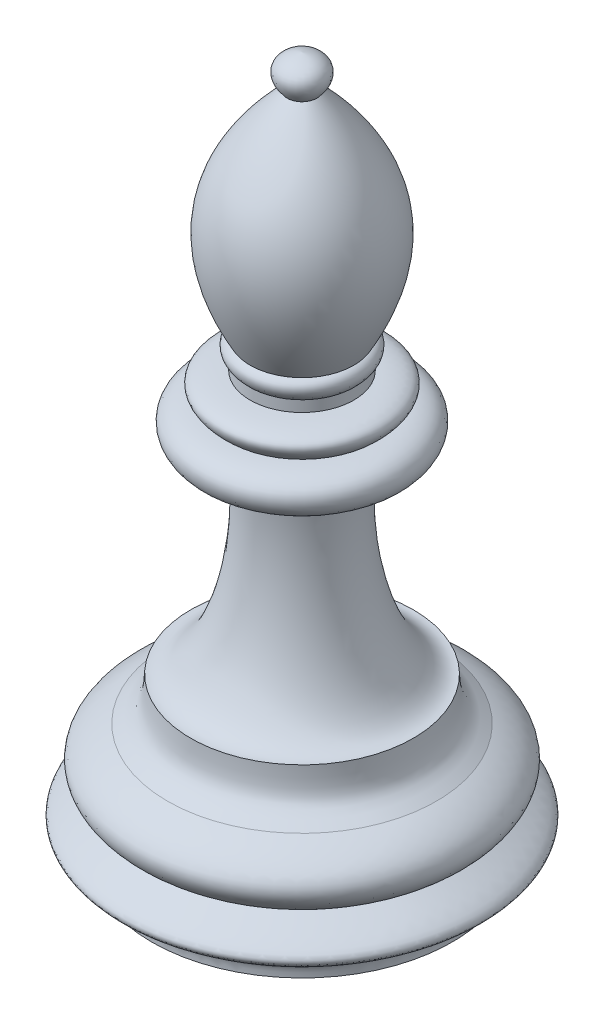
ISO-10303-21;
HEADER;
FILE_DESCRIPTION(('STEP AP214'),'2;1');
FILE_NAME('part.step','',(''),(''),'','','');
FILE_SCHEMA(('AUTOMOTIVE_DESIGN { 1 0 10303 214 1 1 1 1 }'));
ENDSEC;
DATA;
#1=APPLICATION_CONTEXT('core data for automotive mechanical design processes');
#2=APPLICATION_PROTOCOL_DEFINITION('international standard','automotive_design',2000,#1);
#3=PRODUCT_CONTEXT('',#1,'mechanical');
#4=PRODUCT('Part','Part','',(#3));
#5=PRODUCT_RELATED_PRODUCT_CATEGORY('part','',(#4));
#6=PRODUCT_DEFINITION_FORMATION('','',#4);
#7=PRODUCT_DEFINITION_CONTEXT('part definition',#1,'design');
#8=PRODUCT_DEFINITION('design','',#6,#7);
#9=PRODUCT_DEFINITION_SHAPE('','',#8);
#10=(LENGTH_UNIT() NAMED_UNIT(*) SI_UNIT(.MILLI.,.METRE.));
#11=(NAMED_UNIT(*) PLANE_ANGLE_UNIT() SI_UNIT($,.RADIAN.));
#12=(NAMED_UNIT(*) SI_UNIT($,.STERADIAN.) SOLID_ANGLE_UNIT());
#13=UNCERTAINTY_MEASURE_WITH_UNIT(LENGTH_MEASURE(1.E-05),#10,'distance_accuracy_value','');
#14=(GEOMETRIC_REPRESENTATION_CONTEXT(3) GLOBAL_UNCERTAINTY_ASSIGNED_CONTEXT((#13)) GLOBAL_UNIT_ASSIGNED_CONTEXT((#10,
#11,#12)) REPRESENTATION_CONTEXT('',''));
#15=CARTESIAN_POINT('',(0.,0.,0.));
#16=DIRECTION('',(0.,0.,1.));
#17=DIRECTION('',(1.,0.,0.));
#18=AXIS2_PLACEMENT_3D('',#15,#16,#17);
#19=CARTESIAN_POINT('',(6.90189195887826,310.970799108352,0.));
#20=CARTESIAN_POINT('',(13.6012865352146,318.346900207551,0.));
#21=CARTESIAN_POINT('',(10.3189365576846,324.620668456922,0.));
#22=CARTESIAN_POINT('',(0.,326.208286154644,0.));
#23=B_SPLINE_CURVE_WITH_KNOTS('',3,(#19,#20,#21,#22),.UNSPECIFIED.,.F.,.F.,(4,4),(0.,1.),.UNSPECIFIED.);
#24=CARTESIAN_POINT('',(0.,-19.6528747228477,0.));
#25=DIRECTION('',(0.,-1.,0.));
#26=AXIS1_PLACEMENT('',#24,#25);
#27=SURFACE_OF_REVOLUTION('',#23,#26);
#28=CARTESIAN_POINT('',(0.,326.208286154644,0.));
#29=VERTEX_POINT('',#28);
#30=VERTEX_LOOP('',#29);
#31=FACE_BOUND('',#30,.T.);
#32=CARTESIAN_POINT('',(0.,310.970799108353,0.));
#33=DIRECTION('',(0.,-1.,0.));
#34=DIRECTION('',(0.,0.,-1.));
#35=AXIS2_PLACEMENT_3D('',#32,#33,#34);
#36=CIRCLE('',#35,6.90189195887818);
#37=CARTESIAN_POINT('',(0.,310.970799108353,-6.90189195887818));
#38=VERTEX_POINT('',#37);
#39=EDGE_CURVE('E11',#38,#38,#36,.T.);
#40=ORIENTED_EDGE('',*,*,#39,.F.);
#41=EDGE_LOOP('',(#40));
#42=FACE_BOUND('',#41,.T.);
#43=ADVANCED_FACE('F32',(#31,#42),#27,.F.);
#44=CARTESIAN_POINT('',(24.347450730155,211.226381147499,0.));
#45=CARTESIAN_POINT('',(47.436331060875,252.746536673901,0.));
#46=CARTESIAN_POINT('',(36.9222244448542,281.137348254921,0.));
#47=CARTESIAN_POINT('',(6.90189195887818,310.970799108353,0.));
#48=B_SPLINE_CURVE_WITH_KNOTS('',3,(#44,#45,#46,#47),.UNSPECIFIED.,.F.,.F.,(4,4),(0.,1.),.UNSPECIFIED.);
#49=CARTESIAN_POINT('',(0.,-19.6528747228477,0.));
#50=DIRECTION('',(0.,-1.,0.));
#51=AXIS1_PLACEMENT('',#49,#50);
#52=SURFACE_OF_REVOLUTION('',#48,#51);
#53=ORIENTED_EDGE('',*,*,#39,.T.);
#54=EDGE_LOOP('',(#53));
#55=FACE_BOUND('',#54,.T.);
#56=CARTESIAN_POINT('',(0.,211.226381147499,0.));
#57=DIRECTION('',(0.,-1.,0.));
#58=DIRECTION('',(0.,0.,-1.));
#59=AXIS2_PLACEMENT_3D('',#56,#57,#58);
#60=CIRCLE('',#59,24.347450730155);
#61=CARTESIAN_POINT('',(0.,211.226381147499,-24.347450730155));
#62=VERTEX_POINT('',#61);
#63=EDGE_CURVE('E39',#62,#62,#60,.T.);
#64=ORIENTED_EDGE('',*,*,#63,.F.);
#65=EDGE_LOOP('',(#64));
#66=FACE_BOUND('',#65,.T.);
#67=ADVANCED_FACE('F44',(#55,#66),#52,.F.);
#68=CARTESIAN_POINT('',(24.347450730155,202.237263133501,0.));
#69=CARTESIAN_POINT('',(28.0464607133768,205.419181635306,0.));
#70=CARTESIAN_POINT('',(28.259658148254,209.671616611661,0.));
#71=CARTESIAN_POINT('',(24.347450730155,211.226381147499,0.));
#72=B_SPLINE_CURVE_WITH_KNOTS('',3,(#68,#69,#70,#71),.UNSPECIFIED.,.F.,.F.,(4,4),(0.,1.),.UNSPECIFIED.);
#73=CARTESIAN_POINT('',(0.,-19.6528747228477,0.));
#74=DIRECTION('',(0.,-1.,0.));
#75=AXIS1_PLACEMENT('',#73,#74);
#76=SURFACE_OF_REVOLUTION('',#72,#75);
#77=ORIENTED_EDGE('',*,*,#63,.T.);
#78=EDGE_LOOP('',(#77));
#79=FACE_BOUND('',#78,.T.);
#80=CARTESIAN_POINT('',(0.,202.237263133501,0.));
#81=DIRECTION('',(0.,-1.,0.));
#82=DIRECTION('',(0.,0.,-1.));
#83=AXIS2_PLACEMENT_3D('',#80,#81,#82);
#84=CIRCLE('',#83,24.347450730155);
#85=CARTESIAN_POINT('',(0.,202.237263133501,-24.347450730155));
#86=VERTEX_POINT('',#85);
#87=EDGE_CURVE('E53',#86,#86,#84,.T.);
#88=ORIENTED_EDGE('',*,*,#87,.F.);
#89=EDGE_LOOP('',(#88));
#90=FACE_BOUND('',#89,.T.);
#91=ADVANCED_FACE('F49',(#79,#90),#76,.F.);
#92=CARTESIAN_POINT('',(0.,-19.6528747228477,0.));
#93=DIRECTION('',(0.,-1.,0.));
#94=DIRECTION('',(0.,0.,-1.));
#95=AXIS2_PLACEMENT_3D('',#92,#93,#94);
#96=CYLINDRICAL_SURFACE('',#95,24.347450730155);
#97=ORIENTED_EDGE('',*,*,#87,.T.);
#98=EDGE_LOOP('',(#97));
#99=FACE_BOUND('',#98,.T.);
#100=CARTESIAN_POINT('',(0.,197.064280125446,0.));
#101=DIRECTION('',(0.,-1.,0.));
#102=DIRECTION('',(0.,0.,-1.));
#103=AXIS2_PLACEMENT_3D('',#100,#101,#102);
#104=CIRCLE('',#103,24.3474507301549);
#105=CARTESIAN_POINT('',(0.,197.064280125446,-24.3474507301549));
#106=VERTEX_POINT('',#105);
#107=EDGE_CURVE('E55',#106,#106,#104,.T.);
#108=ORIENTED_EDGE('',*,*,#107,.F.);
#109=EDGE_LOOP('',(#108));
#110=FACE_BOUND('',#109,.T.);
#111=ADVANCED_FACE('F101',(#99,#110),#96,.T.);
#112=CARTESIAN_POINT('',(34.3982906018401,185.158229772367,0.));
#113=CARTESIAN_POINT('',(41.8203466835881,191.710066343389,0.));
#114=CARTESIAN_POINT('',(41.2425642562907,196.685583079893,0.));
#115=CARTESIAN_POINT('',(24.3474507301549,197.064280125446,0.));
#116=B_SPLINE_CURVE_WITH_KNOTS('',3,(#112,#113,#114,#115),.UNSPECIFIED.,.F.,.F.,(4,4),(0.,1.),.UNSPECIFIED.);
#117=CARTESIAN_POINT('',(0.,-19.6528747228477,0.));
#118=DIRECTION('',(0.,-1.,0.));
#119=AXIS1_PLACEMENT('',#117,#118);
#120=SURFACE_OF_REVOLUTION('',#116,#119);
#121=ORIENTED_EDGE('',*,*,#107,.T.);
#122=EDGE_LOOP('',(#121));
#123=FACE_BOUND('',#122,.T.);
#124=CARTESIAN_POINT('',(0.,185.158229772367,0.));
#125=DIRECTION('',(0.,-1.,0.));
#126=DIRECTION('',(0.,0.,-1.));
#127=AXIS2_PLACEMENT_3D('',#124,#125,#126);
#128=CIRCLE('',#127,34.39829060184);
#129=CARTESIAN_POINT('',(0.,185.158229772367,-34.39829060184));
#130=VERTEX_POINT('',#129);
#131=EDGE_CURVE('E60',#130,#130,#128,.T.);
#132=ORIENTED_EDGE('',*,*,#131,.F.);
#133=EDGE_LOOP('',(#132));
#134=FACE_BOUND('',#133,.T.);
#135=ADVANCED_FACE('F104',(#123,#134),#120,.F.);
#136=CARTESIAN_POINT('',(25.8078697321369,167.073133204571,0.));
#137=CARTESIAN_POINT('',(33.8022720346989,167.290516182451,0.));
#138=CARTESIAN_POINT('',(39.7315333630957,167.404821133268,0.));
#139=CARTESIAN_POINT('',(49.4191286565708,170.339443630735,0.));
#140=CARTESIAN_POINT('',(52.5946954823075,184.797929731212,0.));
#141=CARTESIAN_POINT('',(34.39829060184,185.158229772367,0.));
#142=B_SPLINE_CURVE_WITH_KNOTS('',3,(#136,#137,#138,#139,#140,#141),.UNSPECIFIED.,.F.,.F.,(4,1,
1,4),(0.,0.251529733401875,0.351529733401875,1.),.UNSPECIFIED.);
#143=CARTESIAN_POINT('',(0.,-19.6528747228477,0.));
#144=DIRECTION('',(0.,-1.,0.));
#145=AXIS1_PLACEMENT('',#143,#144);
#146=SURFACE_OF_REVOLUTION('',#142,#145);
#147=ORIENTED_EDGE('',*,*,#131,.T.);
#148=EDGE_LOOP('',(#147));
#149=FACE_BOUND('',#148,.T.);
#150=CARTESIAN_POINT('',(0.,167.073133204571,0.));
#151=DIRECTION('',(0.,-1.,0.));
#152=DIRECTION('',(0.,0.,-1.));
#153=AXIS2_PLACEMENT_3D('',#150,#151,#152);
#154=CIRCLE('',#153,25.807869732137);
#155=CARTESIAN_POINT('',(0.,167.073133204571,-25.807869732137));
#156=VERTEX_POINT('',#155);
#157=EDGE_CURVE('E63',#156,#156,#154,.T.);
#158=ORIENTED_EDGE('',*,*,#157,.F.);
#159=EDGE_LOOP('',(#158));
#160=FACE_BOUND('',#159,.T.);
#161=ADVANCED_FACE('F108',(#149,#160),#146,.F.);
#162=CARTESIAN_POINT('',(52.2269243798537,73.6408575312875,0.));
#163=CARTESIAN_POINT('',(33.9065972391349,72.2870251961341,0.));
#164=CARTESIAN_POINT('',(18.4352007020311,126.439403207049,0.));
#165=CARTESIAN_POINT('',(25.807869732137,167.073133204571,0.));
#166=B_SPLINE_CURVE_WITH_KNOTS('',3,(#162,#163,#164,#165),.UNSPECIFIED.,.F.,.F.,(4,4),(0.,1.),.UNSPECIFIED.);
#167=CARTESIAN_POINT('',(0.,-19.6528747228477,0.));
#168=DIRECTION('',(0.,-1.,0.));
#169=AXIS1_PLACEMENT('',#167,#168);
#170=SURFACE_OF_REVOLUTION('',#166,#169);
#171=ORIENTED_EDGE('',*,*,#157,.T.);
#172=EDGE_LOOP('',(#171));
#173=FACE_BOUND('',#172,.T.);
#174=CARTESIAN_POINT('',(0.,73.6408575312875,0.));
#175=DIRECTION('',(0.,-1.,0.));
#176=DIRECTION('',(0.,0.,-1.));
#177=AXIS2_PLACEMENT_3D('',#174,#175,#176);
#178=CIRCLE('',#177,52.2269243798537);
#179=CARTESIAN_POINT('',(0.,73.6408575312875,-52.2269243798537));
#180=VERTEX_POINT('',#179);
#181=EDGE_CURVE('E66',#180,#180,#178,.T.);
#182=ORIENTED_EDGE('',*,*,#181,.F.);
#183=EDGE_LOOP('',(#182));
#184=FACE_BOUND('',#183,.T.);
#185=ADVANCED_FACE('F136',(#173,#184),#170,.F.);
#186=CARTESIAN_POINT('',(63.1096217967093,53.5230865956478,0.));
#187=CARTESIAN_POINT('',(54.5201361922393,59.1001242877712,0.));
#188=CARTESIAN_POINT('',(52.833437142875,58.6397751925608,0.));
#189=CARTESIAN_POINT('',(52.2269243798537,73.6408575312875,0.));
#190=B_SPLINE_CURVE_WITH_KNOTS('',3,(#186,#187,#188,#189),.UNSPECIFIED.,.F.,.F.,(4,4),(0.,1.),.UNSPECIFIED.);
#191=CARTESIAN_POINT('',(0.,-19.6528747228477,0.));
#192=DIRECTION('',(0.,-1.,0.));
#193=AXIS1_PLACEMENT('',#191,#192);
#194=SURFACE_OF_REVOLUTION('',#190,#193);
#195=ORIENTED_EDGE('',*,*,#181,.T.);
#196=EDGE_LOOP('',(#195));
#197=FACE_BOUND('',#196,.T.);
#198=CARTESIAN_POINT('',(0.,53.5230865956478,0.));
#199=DIRECTION('',(0.,-1.,0.));
#200=DIRECTION('',(0.,0.,-1.));
#201=AXIS2_PLACEMENT_3D('',#198,#199,#200);
#202=CIRCLE('',#201,63.1096217967093);
#203=CARTESIAN_POINT('',(0.,53.5230865956478,-63.1096217967093));
#204=VERTEX_POINT('',#203);
#205=EDGE_CURVE('E69',#204,#204,#202,.T.);
#206=ORIENTED_EDGE('',*,*,#205,.F.);
#207=EDGE_LOOP('',(#206));
#208=FACE_BOUND('',#207,.T.);
#209=ADVANCED_FACE('F139',(#197,#208),#194,.F.);
#210=CARTESIAN_POINT('',(69.5713071090995,27.1358622492161,0.));
#211=CARTESIAN_POINT('',(90.8047416507592,41.6161115198995,0.));
#212=CARTESIAN_POINT('',(63.1096217967093,53.5230865956478,0.));
#213=B_SPLINE_CURVE_WITH_KNOTS('',2,(#210,#211,#212),.UNSPECIFIED.,.F.,.F.,(3,3),(0.,1.),.UNSPECIFIED.);
#214=CARTESIAN_POINT('',(0.,-19.6528747228477,0.));
#215=DIRECTION('',(0.,-1.,0.));
#216=AXIS1_PLACEMENT('',#214,#215);
#217=SURFACE_OF_REVOLUTION('',#213,#216);
#218=ORIENTED_EDGE('',*,*,#205,.T.);
#219=EDGE_LOOP('',(#218));
#220=FACE_BOUND('',#219,.T.);
#221=CARTESIAN_POINT('',(0.,27.1358622492161,0.));
#222=DIRECTION('',(0.,-1.,0.));
#223=DIRECTION('',(0.,0.,-1.));
#224=AXIS2_PLACEMENT_3D('',#221,#222,#223);
#225=CIRCLE('',#224,69.5713071090995);
#226=CARTESIAN_POINT('',(0.,27.1358622492161,-69.5713071090995));
#227=VERTEX_POINT('',#226);
#228=EDGE_CURVE('E72',#227,#227,#225,.T.);
#229=ORIENTED_EDGE('',*,*,#228,.F.);
#230=EDGE_LOOP('',(#229));
#231=FACE_BOUND('',#230,.T.);
#232=ADVANCED_FACE('F143',(#220,#231),#217,.F.);
#233=CARTESIAN_POINT('',(79.1034767495618,10.885782576428,0.));
#234=CARTESIAN_POINT('',(90.1580297190019,17.0034067891041,0.));
#235=CARTESIAN_POINT('',(84.434936157506,19.0115734042398,0.));
#236=CARTESIAN_POINT('',(69.5713071090995,27.1358622492161,0.));
#237=B_SPLINE_CURVE_WITH_KNOTS('',3,(#233,#234,#235,#236),.UNSPECIFIED.,.F.,.F.,(4,4),(0.,1.),.UNSPECIFIED.);
#238=CARTESIAN_POINT('',(0.,-19.6528747228477,0.));
#239=DIRECTION('',(0.,-1.,0.));
#240=AXIS1_PLACEMENT('',#238,#239);
#241=SURFACE_OF_REVOLUTION('',#237,#240);
#242=ORIENTED_EDGE('',*,*,#228,.T.);
#243=EDGE_LOOP('',(#242));
#244=FACE_BOUND('',#243,.T.);
#245=CARTESIAN_POINT('',(0.,10.885782576428,0.));
#246=DIRECTION('',(0.,-1.,0.));
#247=DIRECTION('',(0.,0.,-1.));
#248=AXIS2_PLACEMENT_3D('',#245,#246,#247);
#249=CIRCLE('',#248,79.1034767495618);
#250=CARTESIAN_POINT('',(0.,10.885782576428,-79.1034767495618));
#251=VERTEX_POINT('',#250);
#252=EDGE_CURVE('E75',#251,#251,#249,.T.);
#253=ORIENTED_EDGE('',*,*,#252,.F.);
#254=EDGE_LOOP('',(#253));
#255=FACE_BOUND('',#254,.T.);
#256=ADVANCED_FACE('F147',(#244,#255),#241,.F.);
#257=CARTESIAN_POINT('',(70.5241918070378,0.,0.));
#258=CARTESIAN_POINT('',(70.4745633097112,6.76395725955746,0.));
#259=CARTESIAN_POINT('',(71.2700662051269,5.75987056907875,0.));
#260=CARTESIAN_POINT('',(79.1034767495618,10.885782576428,0.));
#261=B_SPLINE_CURVE_WITH_KNOTS('',3,(#257,#258,#259,#260),.UNSPECIFIED.,.F.,.F.,(4,4),(0.,1.),.UNSPECIFIED.);
#262=CARTESIAN_POINT('',(0.,-19.6528747228477,0.));
#263=DIRECTION('',(0.,-1.,0.));
#264=AXIS1_PLACEMENT('',#262,#263);
#265=SURFACE_OF_REVOLUTION('',#261,#264);
#266=ORIENTED_EDGE('',*,*,#252,.T.);
#267=EDGE_LOOP('',(#266));
#268=FACE_BOUND('',#267,.T.);
#269=CARTESIAN_POINT('',(0.,0.,0.));
#270=DIRECTION('',(0.,-1.,0.));
#271=DIRECTION('',(0.,0.,-1.));
#272=AXIS2_PLACEMENT_3D('',#269,#270,#271);
#273=CIRCLE('',#272,70.5241918070378);
#274=CARTESIAN_POINT('',(0.,0.,-70.5241918070378));
#275=VERTEX_POINT('',#274);
#276=EDGE_CURVE('E78',#275,#275,#273,.T.);
#277=ORIENTED_EDGE('',*,*,#276,.F.);
#278=EDGE_LOOP('',(#277));
#279=FACE_BOUND('',#278,.T.);
#280=ADVANCED_FACE('F170',(#268,#279),#265,.F.);
#281=CARTESIAN_POINT('',(0.,0.,0.));
#282=DIRECTION('',(0.,-1.,0.));
#283=DIRECTION('',(0.,0.,-1.));
#284=AXIS2_PLACEMENT_3D('',#281,#282,#283);
#285=PLANE('',#284);
#286=ORIENTED_EDGE('',*,*,#276,.T.);
#287=EDGE_LOOP('',(#286));
#288=FACE_BOUND('',#287,.T.);
#289=ADVANCED_FACE('F173',(#288),#285,.T.);
#290=CLOSED_SHELL('',(#43,#67,#91,#111,#135,#161,#185,#209,#232,#256,#280,#289));
#291=MANIFOLD_SOLID_BREP('B2',#290);
#292=ADVANCED_BREP_SHAPE_REPRESENTATION('',(#18,#291),#14);
#293=SHAPE_DEFINITION_REPRESENTATION(#9,#292);
ENDSEC;
END-ISO-10303-21;
